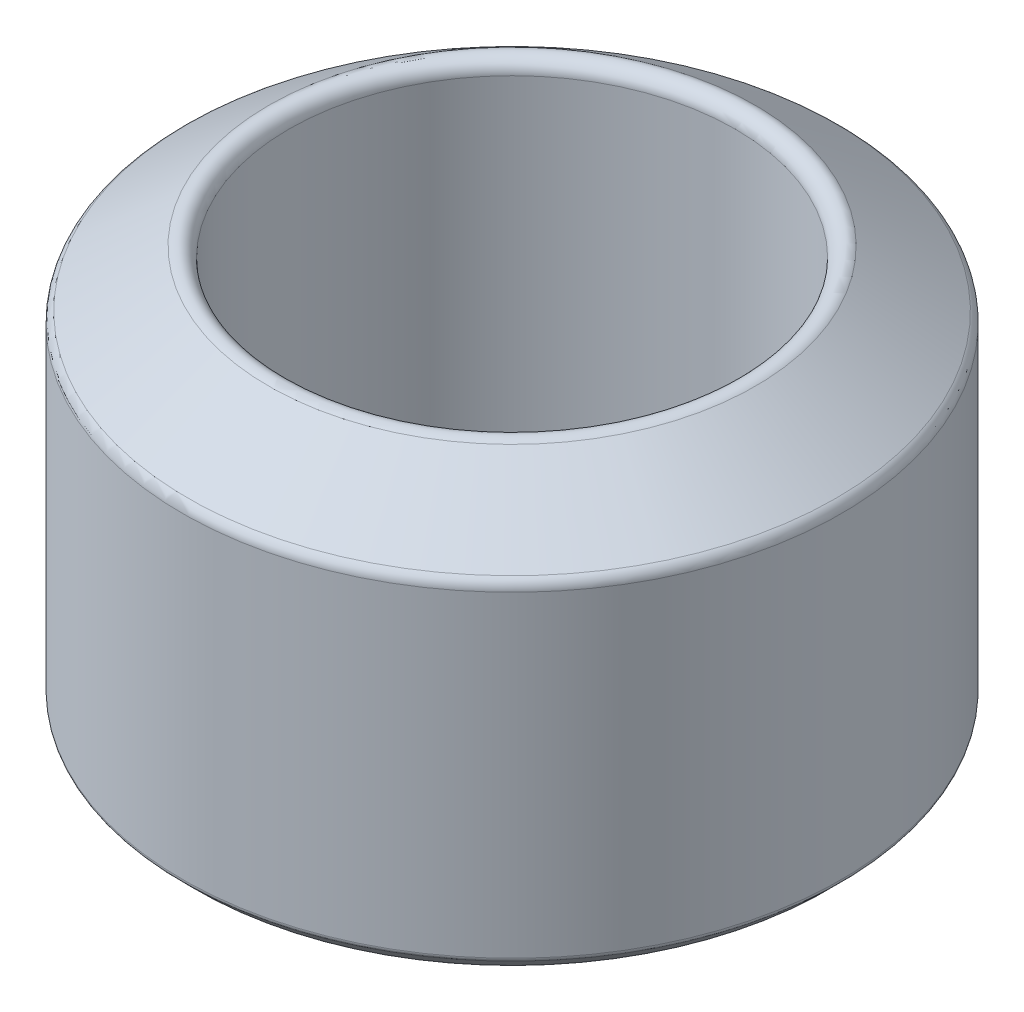
ISO-10303-21;
HEADER;
FILE_DESCRIPTION(('STEP AP214'),'2;1');
FILE_NAME('part.step','',(''),(''),'','','');
FILE_SCHEMA(('AUTOMOTIVE_DESIGN { 1 0 10303 214 1 1 1 1 }'));
ENDSEC;
DATA;
#1=APPLICATION_CONTEXT('core data for automotive mechanical design processes');
#2=APPLICATION_PROTOCOL_DEFINITION('international standard','automotive_design',2000,#1);
#3=PRODUCT_CONTEXT('',#1,'mechanical');
#4=PRODUCT('Part','Part','',(#3));
#5=PRODUCT_RELATED_PRODUCT_CATEGORY('part','',(#4));
#6=PRODUCT_DEFINITION_FORMATION('','',#4);
#7=PRODUCT_DEFINITION_CONTEXT('part definition',#1,'design');
#8=PRODUCT_DEFINITION('design','',#6,#7);
#9=PRODUCT_DEFINITION_SHAPE('','',#8);
#10=(LENGTH_UNIT() NAMED_UNIT(*) SI_UNIT(.MILLI.,.METRE.));
#11=(NAMED_UNIT(*) PLANE_ANGLE_UNIT() SI_UNIT($,.RADIAN.));
#12=(NAMED_UNIT(*) SI_UNIT($,.STERADIAN.) SOLID_ANGLE_UNIT());
#13=UNCERTAINTY_MEASURE_WITH_UNIT(LENGTH_MEASURE(1.E-05),#10,'distance_accuracy_value','');
#14=(GEOMETRIC_REPRESENTATION_CONTEXT(3) GLOBAL_UNCERTAINTY_ASSIGNED_CONTEXT((#13)) GLOBAL_UNIT_ASSIGNED_CONTEXT((#10,
#11,#12)) REPRESENTATION_CONTEXT('',''));
#15=CARTESIAN_POINT('',(0.,0.,0.));
#16=DIRECTION('',(0.,0.,1.));
#17=DIRECTION('',(1.,0.,0.));
#18=AXIS2_PLACEMENT_3D('',#15,#16,#17);
#19=CARTESIAN_POINT('',(0.,7.62268511004235,0.));
#20=DIRECTION('',(0.,1.,0.));
#21=DIRECTION('',(-1.,0.,0.));
#22=AXIS2_PLACEMENT_3D('',#19,#20,#21);
#23=TOROIDAL_SURFACE('',#22,4.6,0.250000000000001);
#24=CARTESIAN_POINT('',(0.,7.82747312111461,0.));
#25=DIRECTION('',(0.,1.,0.));
#26=DIRECTION('',(-1.,0.,0.));
#27=AXIS2_PLACEMENT_3D('',#24,#25,#26);
#28=CIRCLE('',#27,4.74339410908776);
#29=CARTESIAN_POINT('',(-4.74339410908775,7.82747312111461,0.));
#30=VERTEX_POINT('',#29);
#31=EDGE_CURVE('E10',#30,#30,#28,.T.);
#32=ORIENTED_EDGE('',*,*,#31,.T.);
#33=EDGE_LOOP('',(#32));
#34=FACE_BOUND('',#33,.T.);
#35=CARTESIAN_POINT('',(0.,7.62268511004235,0.));
#36=DIRECTION('',(0.,1.,0.));
#37=DIRECTION('',(-1.,0.,0.));
#38=AXIS2_PLACEMENT_3D('',#35,#36,#37);
#39=CIRCLE('',#38,4.35);
#40=CARTESIAN_POINT('',(-4.34999999999999,7.62268511004235,0.));
#41=VERTEX_POINT('',#40);
#42=EDGE_CURVE('E91',#41,#41,#39,.T.);
#43=ORIENTED_EDGE('',*,*,#42,.F.);
#44=EDGE_LOOP('',(#43));
#45=FACE_BOUND('',#44,.T.);
#46=ADVANCED_FACE('F40',(#34,#45),#23,.T.);
#47=CARTESIAN_POINT('',(0.,7.82747312111461,0.));
#48=DIRECTION('',(0.,-1.,0.));
#49=DIRECTION('',(1.,0.,0.));
#50=AXIS2_PLACEMENT_3D('',#47,#48,#49);
#51=CONICAL_SURFACE('',#50,4.74339410908776,0.959931088596882);
#52=CARTESIAN_POINT('',(0.,6.72464624843432,0.));
#53=DIRECTION('',(0.,1.,0.));
#54=DIRECTION('',(-1.,0.,0.));
#55=AXIS2_PLACEMENT_3D('',#52,#53,#54);
#56=CIRCLE('',#55,6.31839410908776);
#57=CARTESIAN_POINT('',(-6.31839410908775,6.72464624843431,0.));
#58=VERTEX_POINT('',#57);
#59=EDGE_CURVE('E47',#58,#58,#56,.T.);
#60=ORIENTED_EDGE('',*,*,#59,.T.);
#61=EDGE_LOOP('',(#60));
#62=FACE_BOUND('',#61,.T.);
#63=ORIENTED_EDGE('',*,*,#31,.F.);
#64=EDGE_LOOP('',(#63));
#65=FACE_BOUND('',#64,.T.);
#66=ADVANCED_FACE('F100',(#62,#65),#51,.T.);
#67=CARTESIAN_POINT('',(0.,6.51985823736206,0.));
#68=DIRECTION('',(0.,1.,0.));
#69=DIRECTION('',(-1.,0.,0.));
#70=AXIS2_PLACEMENT_3D('',#67,#68,#69);
#71=TOROIDAL_SURFACE('',#70,6.175,0.25);
#72=CARTESIAN_POINT('',(0.,6.51985823736206,0.));
#73=DIRECTION('',(0.,1.,0.));
#74=DIRECTION('',(-1.,0.,0.));
#75=AXIS2_PLACEMENT_3D('',#72,#73,#74);
#76=CIRCLE('',#75,6.425);
#77=CARTESIAN_POINT('',(-6.42499999999999,6.51985823736206,0.));
#78=VERTEX_POINT('',#77);
#79=EDGE_CURVE('E52',#78,#78,#76,.T.);
#80=ORIENTED_EDGE('',*,*,#79,.T.);
#81=EDGE_LOOP('',(#80));
#82=FACE_BOUND('',#81,.T.);
#83=ORIENTED_EDGE('',*,*,#59,.F.);
#84=EDGE_LOOP('',(#83));
#85=FACE_BOUND('',#84,.T.);
#86=ADVANCED_FACE('F104',(#82,#85),#71,.T.);
#87=CARTESIAN_POINT('',(0.,79.3046954488858,0.));
#88=DIRECTION('',(0.,1.,0.));
#89=DIRECTION('',(-1.,0.,0.));
#90=AXIS2_PLACEMENT_3D('',#87,#88,#89);
#91=CYLINDRICAL_SURFACE('',#90,6.425);
#92=CARTESIAN_POINT('',(0.,0.341421356237312,0.));
#93=DIRECTION('',(0.,1.,0.));
#94=DIRECTION('',(-1.,0.,0.));
#95=AXIS2_PLACEMENT_3D('',#92,#93,#94);
#96=CIRCLE('',#95,6.425);
#97=CARTESIAN_POINT('',(-6.42499999999999,0.341421356237311,0.));
#98=VERTEX_POINT('',#97);
#99=EDGE_CURVE('E57',#98,#98,#96,.T.);
#100=ORIENTED_EDGE('',*,*,#99,.T.);
#101=EDGE_LOOP('',(#100));
#102=FACE_BOUND('',#101,.T.);
#103=ORIENTED_EDGE('',*,*,#79,.F.);
#104=EDGE_LOOP('',(#103));
#105=FACE_BOUND('',#104,.T.);
#106=ADVANCED_FACE('F108',(#102,#105),#91,.T.);
#107=CARTESIAN_POINT('',(0.,0.341421356237312,0.));
#108=DIRECTION('',(0.,1.,0.));
#109=DIRECTION('',(-1.,0.,0.));
#110=AXIS2_PLACEMENT_3D('',#107,#108,#109);
#111=TOROIDAL_SURFACE('',#110,6.325,0.1);
#112=CARTESIAN_POINT('',(0.,0.270710678118652,0.));
#113=DIRECTION('',(0.,1.,0.));
#114=DIRECTION('',(-1.,0.,0.));
#115=AXIS2_PLACEMENT_3D('',#112,#113,#114);
#116=CIRCLE('',#115,6.39571067811866);
#117=CARTESIAN_POINT('',(-6.39571067811865,0.270710678118651,0.));
#118=VERTEX_POINT('',#117);
#119=EDGE_CURVE('E63',#118,#118,#116,.T.);
#120=ORIENTED_EDGE('',*,*,#119,.T.);
#121=EDGE_LOOP('',(#120));
#122=FACE_BOUND('',#121,.T.);
#123=ORIENTED_EDGE('',*,*,#99,.F.);
#124=EDGE_LOOP('',(#123));
#125=FACE_BOUND('',#124,.T.);
#126=ADVANCED_FACE('F115',(#122,#125),#111,.T.);
#127=CARTESIAN_POINT('',(0.,0.270710678118652,0.));
#128=DIRECTION('',(0.,1.,0.));
#129=DIRECTION('',(-1.,0.,0.));
#130=AXIS2_PLACEMENT_3D('',#127,#128,#129);
#131=CONICAL_SURFACE('',#130,6.39571067811866,0.785398163397448);
#132=CARTESIAN_POINT('',(0.,0.0292893218813428,0.));
#133=DIRECTION('',(0.,1.,0.));
#134=DIRECTION('',(-1.,0.,0.));
#135=AXIS2_PLACEMENT_3D('',#132,#133,#134);
#136=CIRCLE('',#135,6.15428932188135);
#137=CARTESIAN_POINT('',(-6.15428932188134,0.029289321881342,0.));
#138=VERTEX_POINT('',#137);
#139=EDGE_CURVE('E67',#138,#138,#136,.T.);
#140=ORIENTED_EDGE('',*,*,#139,.T.);
#141=EDGE_LOOP('',(#140));
#142=FACE_BOUND('',#141,.T.);
#143=ORIENTED_EDGE('',*,*,#119,.F.);
#144=EDGE_LOOP('',(#143));
#145=FACE_BOUND('',#144,.T.);
#146=ADVANCED_FACE('F119',(#142,#145),#131,.T.);
#147=CARTESIAN_POINT('',(0.,0.1,0.));
#148=DIRECTION('',(0.,1.,0.));
#149=DIRECTION('',(-1.,0.,0.));
#150=AXIS2_PLACEMENT_3D('',#147,#148,#149);
#151=TOROIDAL_SURFACE('',#150,6.08357864376269,0.0999999999999999);
#152=CARTESIAN_POINT('',(0.,0.,0.));
#153=DIRECTION('',(0.,1.,0.));
#154=DIRECTION('',(-1.,0.,0.));
#155=AXIS2_PLACEMENT_3D('',#152,#153,#154);
#156=CIRCLE('',#155,6.08357864376269);
#157=CARTESIAN_POINT('',(-6.08357864376268,0.,0.));
#158=VERTEX_POINT('',#157);
#159=EDGE_CURVE('E71',#158,#158,#156,.T.);
#160=ORIENTED_EDGE('',*,*,#159,.T.);
#161=EDGE_LOOP('',(#160));
#162=FACE_BOUND('',#161,.T.);
#163=ORIENTED_EDGE('',*,*,#139,.F.);
#164=EDGE_LOOP('',(#163));
#165=FACE_BOUND('',#164,.T.);
#166=ADVANCED_FACE('F123',(#162,#165),#151,.T.);
#167=CARTESIAN_POINT('',(-6.08357864376268,0.,0.));
#168=DIRECTION('',(0.,-1.,0.));
#169=DIRECTION('',(1.,0.,0.));
#170=AXIS2_PLACEMENT_3D('',#167,#168,#169);
#171=PLANE('',#170);
#172=CARTESIAN_POINT('',(0.,0.,0.));
#173=DIRECTION('',(0.,1.,0.));
#174=DIRECTION('',(-1.,0.,0.));
#175=AXIS2_PLACEMENT_3D('',#172,#173,#174);
#176=CIRCLE('',#175,5.04142135623731);
#177=CARTESIAN_POINT('',(-5.0414213562373,0.,0.));
#178=VERTEX_POINT('',#177);
#179=EDGE_CURVE('E75',#178,#178,#176,.T.);
#180=ORIENTED_EDGE('',*,*,#179,.T.);
#181=EDGE_LOOP('',(#180));
#182=FACE_BOUND('',#181,.T.);
#183=ORIENTED_EDGE('',*,*,#159,.F.);
#184=EDGE_LOOP('',(#183));
#185=FACE_BOUND('',#184,.T.);
#186=ADVANCED_FACE('F127',(#182,#185),#171,.T.);
#187=CARTESIAN_POINT('',(0.,0.1,0.));
#188=DIRECTION('',(0.,1.,0.));
#189=DIRECTION('',(-1.,0.,0.));
#190=AXIS2_PLACEMENT_3D('',#187,#188,#189);
#191=TOROIDAL_SURFACE('',#190,5.04142135623731,0.0999999999999999);
#192=CARTESIAN_POINT('',(0.,0.0292893218813428,0.));
#193=DIRECTION('',(0.,1.,0.));
#194=DIRECTION('',(-1.,0.,0.));
#195=AXIS2_PLACEMENT_3D('',#192,#193,#194);
#196=CIRCLE('',#195,4.97071067811866);
#197=CARTESIAN_POINT('',(-4.97071067811865,0.0292893218813422,0.));
#198=VERTEX_POINT('',#197);
#199=EDGE_CURVE('E79',#198,#198,#196,.T.);
#200=ORIENTED_EDGE('',*,*,#199,.T.);
#201=EDGE_LOOP('',(#200));
#202=FACE_BOUND('',#201,.T.);
#203=ORIENTED_EDGE('',*,*,#179,.F.);
#204=EDGE_LOOP('',(#203));
#205=FACE_BOUND('',#204,.T.);
#206=ADVANCED_FACE('F131',(#202,#205),#191,.T.);
#207=CARTESIAN_POINT('',(0.,0.0292893218813428,0.));
#208=DIRECTION('',(0.,-1.,0.));
#209=DIRECTION('',(1.,0.,0.));
#210=AXIS2_PLACEMENT_3D('',#207,#208,#209);
#211=CONICAL_SURFACE('',#210,4.97071067811866,0.785398163397435);
#212=CARTESIAN_POINT('',(0.,0.620710678118669,0.));
#213=DIRECTION('',(0.,1.,0.));
#214=DIRECTION('',(-1.,0.,0.));
#215=AXIS2_PLACEMENT_3D('',#212,#213,#214);
#216=CIRCLE('',#215,4.37928932188135);
#217=CARTESIAN_POINT('',(-4.37928932188134,0.620710678118668,0.));
#218=VERTEX_POINT('',#217);
#219=EDGE_CURVE('E83',#218,#218,#216,.T.);
#220=ORIENTED_EDGE('',*,*,#219,.T.);
#221=EDGE_LOOP('',(#220));
#222=FACE_BOUND('',#221,.T.);
#223=ORIENTED_EDGE('',*,*,#199,.F.);
#224=EDGE_LOOP('',(#223));
#225=FACE_BOUND('',#224,.T.);
#226=ADVANCED_FACE('F135',(#222,#225),#211,.F.);
#227=CARTESIAN_POINT('',(0.,0.691421356237317,0.));
#228=DIRECTION('',(0.,1.,0.));
#229=DIRECTION('',(-1.,0.,0.));
#230=AXIS2_PLACEMENT_3D('',#227,#228,#229);
#231=TOROIDAL_SURFACE('',#230,4.45,0.1);
#232=CARTESIAN_POINT('',(0.,0.691421356237315,0.));
#233=DIRECTION('',(0.,1.,0.));
#234=DIRECTION('',(-1.,0.,0.));
#235=AXIS2_PLACEMENT_3D('',#232,#233,#234);
#236=CIRCLE('',#235,4.35);
#237=CARTESIAN_POINT('',(-4.34999999999999,0.691421356237314,0.));
#238=VERTEX_POINT('',#237);
#239=EDGE_CURVE('E87',#238,#238,#236,.T.);
#240=ORIENTED_EDGE('',*,*,#239,.T.);
#241=EDGE_LOOP('',(#240));
#242=FACE_BOUND('',#241,.T.);
#243=ORIENTED_EDGE('',*,*,#219,.F.);
#244=EDGE_LOOP('',(#243));
#245=FACE_BOUND('',#244,.T.);
#246=ADVANCED_FACE('F139',(#242,#245),#231,.T.);
#247=CARTESIAN_POINT('',(0.,79.3046954488858,0.));
#248=DIRECTION('',(0.,1.,0.));
#249=DIRECTION('',(-1.,0.,0.));
#250=AXIS2_PLACEMENT_3D('',#247,#248,#249);
#251=CYLINDRICAL_SURFACE('',#250,4.35);
#252=ORIENTED_EDGE('',*,*,#42,.T.);
#253=EDGE_LOOP('',(#252));
#254=FACE_BOUND('',#253,.T.);
#255=ORIENTED_EDGE('',*,*,#239,.F.);
#256=EDGE_LOOP('',(#255));
#257=FACE_BOUND('',#256,.T.);
#258=ADVANCED_FACE('F96',(#254,#257),#251,.F.);
#259=CLOSED_SHELL('',(#46,#66,#86,#106,#126,#146,#166,#186,#206,#226,#246,#258));
#260=MANIFOLD_SOLID_BREP('B2',#259);
#261=ADVANCED_BREP_SHAPE_REPRESENTATION('',(#18,#260),#14);
#262=SHAPE_DEFINITION_REPRESENTATION(#9,#261);
ENDSEC;
END-ISO-10303-21;
